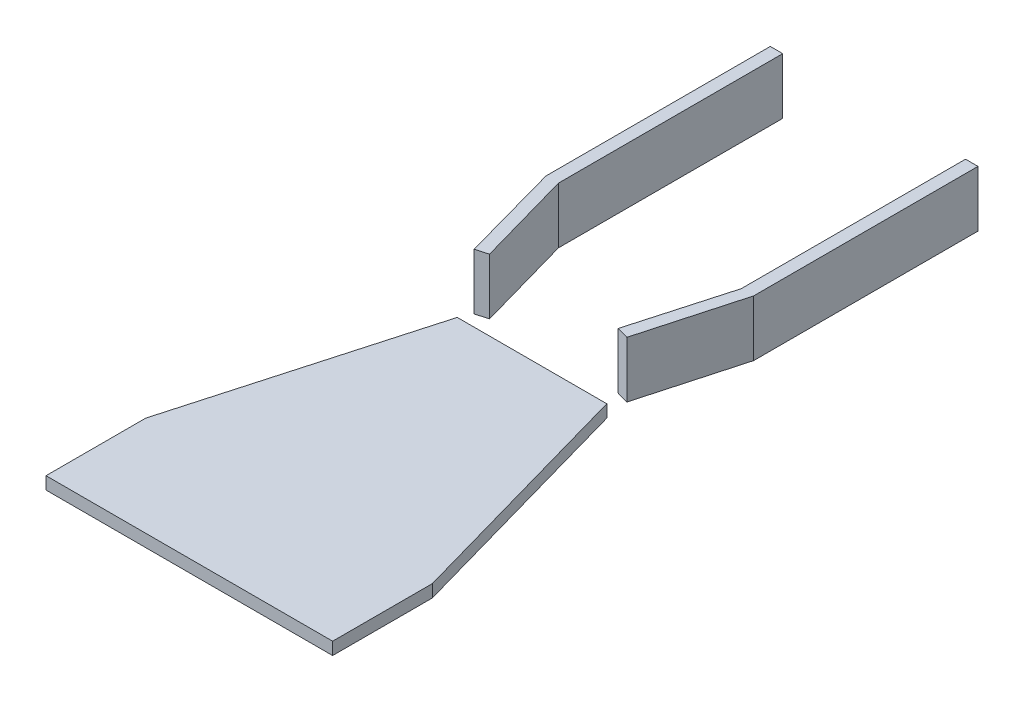
ISO-10303-21;
HEADER;
FILE_DESCRIPTION(('STEP AP214'),'2;1');
FILE_NAME('part.step','',(''),(''),'','','');
FILE_SCHEMA(('AUTOMOTIVE_DESIGN { 1 0 10303 214 1 1 1 1 }'));
ENDSEC;
DATA;
#1=APPLICATION_CONTEXT('core data for automotive mechanical design processes');
#2=APPLICATION_PROTOCOL_DEFINITION('international standard','automotive_design',2000,#1);
#3=PRODUCT_CONTEXT('',#1,'mechanical');
#4=PRODUCT('Part','Part','',(#3));
#5=PRODUCT_RELATED_PRODUCT_CATEGORY('part','',(#4));
#6=PRODUCT_DEFINITION_FORMATION('','',#4);
#7=PRODUCT_DEFINITION_CONTEXT('part definition',#1,'design');
#8=PRODUCT_DEFINITION('design','',#6,#7);
#9=PRODUCT_DEFINITION_SHAPE('','',#8);
#10=(LENGTH_UNIT() NAMED_UNIT(*) SI_UNIT(.MILLI.,.METRE.));
#11=(NAMED_UNIT(*) PLANE_ANGLE_UNIT() SI_UNIT($,.RADIAN.));
#12=(NAMED_UNIT(*) SI_UNIT($,.STERADIAN.) SOLID_ANGLE_UNIT());
#13=UNCERTAINTY_MEASURE_WITH_UNIT(LENGTH_MEASURE(1.E-05),#10,'distance_accuracy_value','');
#14=(GEOMETRIC_REPRESENTATION_CONTEXT(3) GLOBAL_UNCERTAINTY_ASSIGNED_CONTEXT((#13)) GLOBAL_UNIT_ASSIGNED_CONTEXT((#10,
#11,#12)) REPRESENTATION_CONTEXT('',''));
#15=CARTESIAN_POINT('',(0.,0.,0.));
#16=DIRECTION('',(0.,0.,1.));
#17=DIRECTION('',(1.,0.,0.));
#18=AXIS2_PLACEMENT_3D('',#15,#16,#17);
#19=CARTESIAN_POINT('',(-25.6803764915172,4.5,0.));
#20=DIRECTION('',(-1.,0.,0.));
#21=DIRECTION('',(0.,0.,-1.));
#22=AXIS2_PLACEMENT_3D('',#19,#20,#21);
#23=PLANE('',#22);
#24=DIRECTION('',(0.,0.,1.));
#25=VECTOR('',#24,1.);
#26=CARTESIAN_POINT('',(-25.6803764915172,0.,0.));
#27=LINE('',#26,#25);
#28=CARTESIAN_POINT('',(-25.6803764915172,0.,-40.5758367942845));
#29=VERTEX_POINT('',#28);
#30=CARTESIAN_POINT('',(-25.6803764915172,0.,-22.5758367942845));
#31=VERTEX_POINT('',#30);
#32=EDGE_CURVE('E141',#29,#31,#27,.T.);
#33=ORIENTED_EDGE('',*,*,#32,.T.);
#34=DIRECTION('',(0.,-1.,0.));
#35=VECTOR('',#34,1.);
#36=CARTESIAN_POINT('',(-25.6803764915172,4.5,-22.5758367942845));
#37=LINE('',#36,#35);
#38=CARTESIAN_POINT('',(-25.6803764915172,4.5,-22.5758367942845));
#39=VERTEX_POINT('',#38);
#40=EDGE_CURVE('E140',#39,#31,#37,.T.);
#41=ORIENTED_EDGE('',*,*,#40,.F.);
#42=DIRECTION('',(0.,0.,1.));
#43=VECTOR('',#42,1.);
#44=CARTESIAN_POINT('',(-25.6803764915172,4.5,0.));
#45=LINE('',#44,#43);
#46=CARTESIAN_POINT('',(-25.6803764915172,4.5,-40.5758367942845));
#47=VERTEX_POINT('',#46);
#48=EDGE_CURVE('E153',#47,#39,#45,.T.);
#49=ORIENTED_EDGE('',*,*,#48,.F.);
#50=DIRECTION('',(0.,-1.,0.));
#51=VECTOR('',#50,1.);
#52=CARTESIAN_POINT('',(-25.6803764915172,4.5,-40.5758367942845));
#53=LINE('',#52,#51);
#54=EDGE_CURVE('E12',#47,#29,#53,.T.);
#55=ORIENTED_EDGE('',*,*,#54,.T.);
#56=EDGE_LOOP('',(#33,#41,#49,#55));
#57=FACE_BOUND('',#56,.T.);
#58=ADVANCED_FACE('F58',(#57),#23,.T.);
#59=CARTESIAN_POINT('',(-66.0287413715997,4.5,-40.5758367942845));
#60=DIRECTION('',(0.,0.,-1.));
#61=DIRECTION('',(1.,0.,0.));
#62=AXIS2_PLACEMENT_3D('',#59,#60,#61);
#63=PLANE('',#62);
#64=DIRECTION('',(-1.,0.,0.));
#65=VECTOR('',#64,1.);
#66=CARTESIAN_POINT('',(-66.0287413715997,0.,-40.5758367942845));
#67=LINE('',#66,#65);
#68=CARTESIAN_POINT('',(-24.6803764915172,0.,-40.5758367942845));
#69=VERTEX_POINT('',#68);
#70=EDGE_CURVE('E144',#69,#29,#67,.T.);
#71=ORIENTED_EDGE('',*,*,#70,.T.);
#72=ORIENTED_EDGE('',*,*,#54,.F.);
#73=DIRECTION('',(-1.,0.,0.));
#74=VECTOR('',#73,1.);
#75=CARTESIAN_POINT('',(-66.0287413715997,4.5,-40.5758367942845));
#76=LINE('',#75,#74);
#77=CARTESIAN_POINT('',(-24.6803764915172,4.5,-40.5758367942845));
#78=VERTEX_POINT('',#77);
#79=EDGE_CURVE('E106',#78,#47,#76,.T.);
#80=ORIENTED_EDGE('',*,*,#79,.F.);
#81=DIRECTION('',(0.,-1.,0.));
#82=VECTOR('',#81,1.);
#83=CARTESIAN_POINT('',(-24.6803764915172,4.5,-40.5758367942845));
#84=LINE('',#83,#82);
#85=EDGE_CURVE('E66',#78,#69,#84,.T.);
#86=ORIENTED_EDGE('',*,*,#85,.T.);
#87=EDGE_LOOP('',(#71,#72,#80,#86));
#88=FACE_BOUND('',#87,.T.);
#89=ADVANCED_FACE('F160',(#88),#63,.T.);
#90=CARTESIAN_POINT('',(-24.6803764915172,4.5,0.));
#91=DIRECTION('',(-1.,0.,0.));
#92=DIRECTION('',(0.,0.,-1.));
#93=AXIS2_PLACEMENT_3D('',#90,#91,#92);
#94=PLANE('',#93);
#95=DIRECTION('',(0.,0.,1.));
#96=VECTOR('',#95,1.);
#97=CARTESIAN_POINT('',(-24.6803764915172,0.,0.));
#98=LINE('',#97,#96);
#99=CARTESIAN_POINT('',(-24.6803764915172,0.,-22.5758367942845));
#100=VERTEX_POINT('',#99);
#101=EDGE_CURVE('E146',#69,#100,#98,.T.);
#102=ORIENTED_EDGE('',*,*,#101,.F.);
#103=ORIENTED_EDGE('',*,*,#85,.F.);
#104=DIRECTION('',(0.,0.,1.));
#105=VECTOR('',#104,1.);
#106=CARTESIAN_POINT('',(-24.6803764915172,4.5,0.));
#107=LINE('',#106,#105);
#108=CARTESIAN_POINT('',(-24.6803764915172,4.5,-22.5758367942845));
#109=VERTEX_POINT('',#108);
#110=EDGE_CURVE('E134',#78,#109,#107,.T.);
#111=ORIENTED_EDGE('',*,*,#110,.T.);
#112=DIRECTION('',(0.,-1.,0.));
#113=VECTOR('',#112,1.);
#114=CARTESIAN_POINT('',(-24.6803764915172,4.5,-22.5758367942845));
#115=LINE('',#114,#113);
#116=EDGE_CURVE('E128',#109,#100,#115,.T.);
#117=ORIENTED_EDGE('',*,*,#116,.T.);
#118=EDGE_LOOP('',(#102,#103,#111,#117));
#119=FACE_BOUND('',#118,.T.);
#120=ADVANCED_FACE('F181',(#119),#94,.F.);
#121=CARTESIAN_POINT('',(-33.4406969264378,4.5,9.03199335039239));
#122=DIRECTION('',(0.963672105815585,0.,0.267088136151637));
#123=DIRECTION('',(-0.267088136151637,0.,0.963672105815585));
#124=AXIS2_PLACEMENT_3D('',#121,#122,#123);
#125=PLANE('',#124);
#126=DIRECTION('',(0.267088136151637,0.,-0.963672105815585));
#127=VECTOR('',#126,1.);
#128=CARTESIAN_POINT('',(-33.4406969264378,0.,9.03199335039239));
#129=LINE('',#128,#127);
#130=CARTESIAN_POINT('',(-26.8896081352248,0.,-14.6047792212986));
#131=VERTEX_POINT('',#130);
#132=EDGE_CURVE('E149',#131,#100,#129,.T.);
#133=ORIENTED_EDGE('',*,*,#132,.T.);
#134=ORIENTED_EDGE('',*,*,#116,.F.);
#135=DIRECTION('',(0.267088136151637,0.,-0.963672105815585));
#136=VECTOR('',#135,1.);
#137=CARTESIAN_POINT('',(-33.4406969264378,4.5,9.03199335039239));
#138=LINE('',#137,#136);
#139=CARTESIAN_POINT('',(-26.8896081352248,4.5,-14.6047792212986));
#140=VERTEX_POINT('',#139);
#141=EDGE_CURVE('E118',#140,#109,#138,.T.);
#142=ORIENTED_EDGE('',*,*,#141,.F.);
#143=DIRECTION('',(0.,-1.,0.));
#144=VECTOR('',#143,1.);
#145=CARTESIAN_POINT('',(-26.8896081352248,4.5,-14.6047792212986));
#146=LINE('',#145,#144);
#147=EDGE_CURVE('E123',#140,#131,#146,.T.);
#148=ORIENTED_EDGE('',*,*,#147,.T.);
#149=EDGE_LOOP('',(#133,#134,#142,#148));
#150=FACE_BOUND('',#149,.T.);
#151=ADVANCED_FACE('F131',(#150),#125,.T.);
#152=CARTESIAN_POINT('',(-59.3288111619271,4.5,-23.7542980215912));
#153=DIRECTION('',(-0.271460164963802,0.,0.962449676002764));
#154=DIRECTION('',(-0.962449676002764,0.,-0.271460164963802));
#155=AXIS2_PLACEMENT_3D('',#152,#153,#154);
#156=PLANE('',#155);
#157=DIRECTION('',(0.962449676002764,0.,0.271460164963802));
#158=VECTOR('',#157,1.);
#159=CARTESIAN_POINT('',(-59.3288111619271,0.,-23.7542980215912));
#160=LINE('',#159,#158);
#161=CARTESIAN_POINT('',(-27.8520578112276,0.,-14.8762393862624));
#162=VERTEX_POINT('',#161);
#163=EDGE_CURVE('E125',#162,#131,#160,.T.);
#164=ORIENTED_EDGE('',*,*,#163,.T.);
#165=ORIENTED_EDGE('',*,*,#147,.F.);
#166=DIRECTION('',(0.962449676002764,0.,0.271460164963802));
#167=VECTOR('',#166,1.);
#168=CARTESIAN_POINT('',(-59.3288111619271,4.5,-23.7542980215912));
#169=LINE('',#168,#167);
#170=CARTESIAN_POINT('',(-27.8520578112276,4.5,-14.8762393862624));
#171=VERTEX_POINT('',#170);
#172=EDGE_CURVE('E114',#171,#140,#169,.T.);
#173=ORIENTED_EDGE('',*,*,#172,.F.);
#174=DIRECTION('',(0.,-1.,0.));
#175=VECTOR('',#174,1.);
#176=CARTESIAN_POINT('',(-27.8520578112276,4.5,-14.8762393862624));
#177=LINE('',#176,#175);
#178=EDGE_CURVE('E129',#171,#162,#177,.T.);
#179=ORIENTED_EDGE('',*,*,#178,.T.);
#180=EDGE_LOOP('',(#164,#165,#173,#179));
#181=FACE_BOUND('',#180,.T.);
#182=ADVANCED_FACE('F124',(#181),#156,.T.);
#183=CARTESIAN_POINT('',(-34.5519880209002,4.5,8.87805863532892));
#184=DIRECTION('',(-0.962449676002763,0.,-0.271460164963804));
#185=DIRECTION('',(0.271460164963804,0.,-0.962449676002764));
#186=AXIS2_PLACEMENT_3D('',#183,#184,#185);
#187=PLANE('',#186);
#188=DIRECTION('',(-0.271460164963804,0.,0.962449676002763));
#189=VECTOR('',#188,1.);
#190=CARTESIAN_POINT('',(-34.5519880209002,0.,8.87805863532892));
#191=LINE('',#190,#189);
#192=EDGE_CURVE('E94',#31,#162,#191,.T.);
#193=ORIENTED_EDGE('',*,*,#192,.T.);
#194=ORIENTED_EDGE('',*,*,#178,.F.);
#195=DIRECTION('',(-0.271460164963804,0.,0.962449676002763));
#196=VECTOR('',#195,1.);
#197=CARTESIAN_POINT('',(-34.5519880209002,4.5,8.87805863532892));
#198=LINE('',#197,#196);
#199=EDGE_CURVE('E74',#39,#171,#198,.T.);
#200=ORIENTED_EDGE('',*,*,#199,.F.);
#201=ORIENTED_EDGE('',*,*,#40,.T.);
#202=EDGE_LOOP('',(#193,#194,#200,#201));
#203=FACE_BOUND('',#202,.T.);
#204=ADVANCED_FACE('F167',(#203),#187,.T.);
#205=CARTESIAN_POINT('',(-66.0287413715997,4.5,0.));
#206=DIRECTION('',(0.,1.,0.));
#207=DIRECTION('',(0.,0.,1.));
#208=AXIS2_PLACEMENT_3D('',#205,#206,#207);
#209=PLANE('',#208);
#210=ORIENTED_EDGE('',*,*,#48,.T.);
#211=ORIENTED_EDGE('',*,*,#199,.T.);
#212=ORIENTED_EDGE('',*,*,#172,.T.);
#213=ORIENTED_EDGE('',*,*,#141,.T.);
#214=ORIENTED_EDGE('',*,*,#110,.F.);
#215=ORIENTED_EDGE('',*,*,#79,.T.);
#216=EDGE_LOOP('',(#210,#211,#212,#213,#214,#215));
#217=FACE_BOUND('',#216,.T.);
#218=ADVANCED_FACE('F116',(#217),#209,.T.);
#219=CARTESIAN_POINT('',(-66.0287413715997,0.,0.));
#220=DIRECTION('',(0.,1.,0.));
#221=DIRECTION('',(0.,0.,1.));
#222=AXIS2_PLACEMENT_3D('',#219,#220,#221);
#223=PLANE('',#222);
#224=ORIENTED_EDGE('',*,*,#32,.F.);
#225=ORIENTED_EDGE('',*,*,#70,.F.);
#226=ORIENTED_EDGE('',*,*,#101,.T.);
#227=ORIENTED_EDGE('',*,*,#132,.F.);
#228=ORIENTED_EDGE('',*,*,#163,.F.);
#229=ORIENTED_EDGE('',*,*,#192,.F.);
#230=EDGE_LOOP('',(#224,#225,#226,#227,#228,#229));
#231=FACE_BOUND('',#230,.T.);
#232=ADVANCED_FACE('F162',(#231),#223,.F.);
#233=CLOSED_SHELL('',(#58,#89,#120,#151,#182,#204,#218,#232));
#234=MANIFOLD_SOLID_BREP('B2',#233);
#235=CARTESIAN_POINT('',(-40.3483648800825,4.5,0.));
#236=DIRECTION('',(1.,0.,0.));
#237=DIRECTION('',(0.,0.,-1.));
#238=AXIS2_PLACEMENT_3D('',#235,#236,#237);
#239=PLANE('',#238);
#240=DIRECTION('',(0.,0.,1.));
#241=VECTOR('',#240,1.);
#242=CARTESIAN_POINT('',(-40.3483648800825,0.,0.));
#243=LINE('',#242,#241);
#244=CARTESIAN_POINT('',(-40.3483648800825,0.,-40.5758367942845));
#245=VERTEX_POINT('',#244);
#246=CARTESIAN_POINT('',(-40.3483648800825,0.,-22.5758367942845));
#247=VERTEX_POINT('',#246);
#248=EDGE_CURVE('E330',#245,#247,#243,.T.);
#249=ORIENTED_EDGE('',*,*,#248,.F.);
#250=DIRECTION('',(0.,-1.,0.));
#251=VECTOR('',#250,1.);
#252=CARTESIAN_POINT('',(-40.3483648800825,4.5,-40.5758367942845));
#253=LINE('',#252,#251);
#254=CARTESIAN_POINT('',(-40.3483648800825,4.5,-40.5758367942845));
#255=VERTEX_POINT('',#254);
#256=EDGE_CURVE('E56',#255,#245,#253,.T.);
#257=ORIENTED_EDGE('',*,*,#256,.F.);
#258=DIRECTION('',(0.,0.,1.));
#259=VECTOR('',#258,1.);
#260=CARTESIAN_POINT('',(-40.3483648800825,4.5,0.));
#261=LINE('',#260,#259);
#262=CARTESIAN_POINT('',(-40.3483648800825,4.5,-22.5758367942845));
#263=VERTEX_POINT('',#262);
#264=EDGE_CURVE('E344',#255,#263,#261,.T.);
#265=ORIENTED_EDGE('',*,*,#264,.T.);
#266=DIRECTION('',(0.,-1.,0.));
#267=VECTOR('',#266,1.);
#268=CARTESIAN_POINT('',(-40.3483648800825,4.5,-22.5758367942845));
#269=LINE('',#268,#267);
#270=EDGE_CURVE('E265',#263,#247,#269,.T.);
#271=ORIENTED_EDGE('',*,*,#270,.T.);
#272=EDGE_LOOP('',(#249,#257,#265,#271));
#273=FACE_BOUND('',#272,.T.);
#274=ADVANCED_FACE('F249',(#273),#239,.T.);
#275=CARTESIAN_POINT('',(0.,4.5,-40.5758367942845));
#276=DIRECTION('',(0.,0.,-1.));
#277=DIRECTION('',(-1.,0.,0.));
#278=AXIS2_PLACEMENT_3D('',#275,#276,#277);
#279=PLANE('',#278);
#280=DIRECTION('',(1.,0.,0.));
#281=VECTOR('',#280,1.);
#282=CARTESIAN_POINT('',(0.,0.,-40.5758367942845));
#283=LINE('',#282,#281);
#284=CARTESIAN_POINT('',(-41.3483648800825,0.,-40.5758367942845));
#285=VERTEX_POINT('',#284);
#286=EDGE_CURVE('E332',#285,#245,#283,.T.);
#287=ORIENTED_EDGE('',*,*,#286,.F.);
#288=DIRECTION('',(0.,-1.,0.));
#289=VECTOR('',#288,1.);
#290=CARTESIAN_POINT('',(-41.3483648800825,4.5,-40.5758367942845));
#291=LINE('',#290,#289);
#292=CARTESIAN_POINT('',(-41.3483648800825,4.5,-40.5758367942845));
#293=VERTEX_POINT('',#292);
#294=EDGE_CURVE('E257',#293,#285,#291,.T.);
#295=ORIENTED_EDGE('',*,*,#294,.F.);
#296=DIRECTION('',(1.,0.,0.));
#297=VECTOR('',#296,1.);
#298=CARTESIAN_POINT('',(0.,4.5,-40.5758367942845));
#299=LINE('',#298,#297);
#300=EDGE_CURVE('E356',#293,#255,#299,.T.);
#301=ORIENTED_EDGE('',*,*,#300,.T.);
#302=ORIENTED_EDGE('',*,*,#256,.T.);
#303=EDGE_LOOP('',(#287,#295,#301,#302));
#304=FACE_BOUND('',#303,.T.);
#305=ADVANCED_FACE('F355',(#304),#279,.T.);
#306=CARTESIAN_POINT('',(-41.3483648800825,4.5,0.));
#307=DIRECTION('',(1.,0.,0.));
#308=DIRECTION('',(0.,0.,-1.));
#309=AXIS2_PLACEMENT_3D('',#306,#307,#308);
#310=PLANE('',#309);
#311=DIRECTION('',(0.,0.,1.));
#312=VECTOR('',#311,1.);
#313=CARTESIAN_POINT('',(-41.3483648800825,0.,0.));
#314=LINE('',#313,#312);
#315=CARTESIAN_POINT('',(-41.3483648800825,0.,-22.5758367942845));
#316=VERTEX_POINT('',#315);
#317=EDGE_CURVE('E335',#285,#316,#314,.T.);
#318=ORIENTED_EDGE('',*,*,#317,.T.);
#319=DIRECTION('',(0.,-1.,0.));
#320=VECTOR('',#319,1.);
#321=CARTESIAN_POINT('',(-41.3483648800825,4.5,-22.5758367942845));
#322=LINE('',#321,#320);
#323=CARTESIAN_POINT('',(-41.3483648800825,4.5,-22.5758367942845));
#324=VERTEX_POINT('',#323);
#325=EDGE_CURVE('E312',#324,#316,#322,.T.);
#326=ORIENTED_EDGE('',*,*,#325,.F.);
#327=DIRECTION('',(0.,0.,1.));
#328=VECTOR('',#327,1.);
#329=CARTESIAN_POINT('',(-41.3483648800825,4.5,0.));
#330=LINE('',#329,#328);
#331=EDGE_CURVE('E321',#293,#324,#330,.T.);
#332=ORIENTED_EDGE('',*,*,#331,.F.);
#333=ORIENTED_EDGE('',*,*,#294,.T.);
#334=EDGE_LOOP('',(#318,#326,#332,#333));
#335=FACE_BOUND('',#334,.T.);
#336=ADVANCED_FACE('F349',(#335),#310,.F.);
#337=CARTESIAN_POINT('',(-32.5880444451619,4.5,9.03199335039239));
#338=DIRECTION('',(-0.963672105815585,0.,0.267088136151637));
#339=DIRECTION('',(0.267088136151637,0.,0.963672105815585));
#340=AXIS2_PLACEMENT_3D('',#337,#338,#339);
#341=PLANE('',#340);
#342=DIRECTION('',(-0.267088136151637,0.,-0.963672105815585));
#343=VECTOR('',#342,1.);
#344=CARTESIAN_POINT('',(-32.5880444451619,0.,9.03199335039239));
#345=LINE('',#344,#343);
#346=CARTESIAN_POINT('',(-39.1391332363749,0.,-14.6047792212986));
#347=VERTEX_POINT('',#346);
#348=EDGE_CURVE('E308',#347,#316,#345,.T.);
#349=ORIENTED_EDGE('',*,*,#348,.F.);
#350=DIRECTION('',(0.,-1.,0.));
#351=VECTOR('',#350,1.);
#352=CARTESIAN_POINT('',(-39.1391332363749,4.5,-14.6047792212986));
#353=LINE('',#352,#351);
#354=CARTESIAN_POINT('',(-39.1391332363749,4.5,-14.6047792212986));
#355=VERTEX_POINT('',#354);
#356=EDGE_CURVE('E303',#355,#347,#353,.T.);
#357=ORIENTED_EDGE('',*,*,#356,.F.);
#358=DIRECTION('',(-0.267088136151637,0.,-0.963672105815585));
#359=VECTOR('',#358,1.);
#360=CARTESIAN_POINT('',(-32.5880444451619,4.5,9.03199335039239));
#361=LINE('',#360,#359);
#362=EDGE_CURVE('E306',#355,#324,#361,.T.);
#363=ORIENTED_EDGE('',*,*,#362,.T.);
#364=ORIENTED_EDGE('',*,*,#325,.T.);
#365=EDGE_LOOP('',(#349,#357,#363,#364));
#366=FACE_BOUND('',#365,.T.);
#367=ADVANCED_FACE('F305',(#366),#341,.T.);
#368=CARTESIAN_POINT('',(-6.69993020967255,4.5,-23.7542980215912));
#369=DIRECTION('',(0.271460164963802,0.,0.962449676002764));
#370=DIRECTION('',(0.962449676002764,0.,-0.271460164963802));
#371=AXIS2_PLACEMENT_3D('',#368,#369,#370);
#372=PLANE('',#371);
#373=DIRECTION('',(-0.962449676002764,0.,0.271460164963802));
#374=VECTOR('',#373,1.);
#375=CARTESIAN_POINT('',(-6.69993020967255,0.,-23.7542980215912));
#376=LINE('',#375,#374);
#377=CARTESIAN_POINT('',(-38.1766835603721,0.,-14.8762393862624));
#378=VERTEX_POINT('',#377);
#379=EDGE_CURVE('E339',#378,#347,#376,.T.);
#380=ORIENTED_EDGE('',*,*,#379,.F.);
#381=DIRECTION('',(0.,-1.,0.));
#382=VECTOR('',#381,1.);
#383=CARTESIAN_POINT('',(-38.1766835603721,4.5,-14.8762393862624));
#384=LINE('',#383,#382);
#385=CARTESIAN_POINT('',(-38.1766835603721,4.5,-14.8762393862624));
#386=VERTEX_POINT('',#385);
#387=EDGE_CURVE('E284',#386,#378,#384,.T.);
#388=ORIENTED_EDGE('',*,*,#387,.F.);
#389=DIRECTION('',(-0.962449676002764,0.,0.271460164963802));
#390=VECTOR('',#389,1.);
#391=CARTESIAN_POINT('',(-6.69993020967255,4.5,-23.7542980215912));
#392=LINE('',#391,#390);
#393=EDGE_CURVE('E318',#386,#355,#392,.T.);
#394=ORIENTED_EDGE('',*,*,#393,.T.);
#395=ORIENTED_EDGE('',*,*,#356,.T.);
#396=EDGE_LOOP('',(#380,#388,#394,#395));
#397=FACE_BOUND('',#396,.T.);
#398=ADVANCED_FACE('F324',(#397),#372,.T.);
#399=CARTESIAN_POINT('',(-31.4767533506995,4.5,8.87805863532892));
#400=DIRECTION('',(0.962449676002763,0.,-0.271460164963804));
#401=DIRECTION('',(-0.271460164963804,0.,-0.962449676002764));
#402=AXIS2_PLACEMENT_3D('',#399,#400,#401);
#403=PLANE('',#402);
#404=DIRECTION('',(0.271460164963804,0.,0.962449676002763));
#405=VECTOR('',#404,1.);
#406=CARTESIAN_POINT('',(-31.4767533506995,0.,8.87805863532892));
#407=LINE('',#406,#405);
#408=EDGE_CURVE('E341',#247,#378,#407,.T.);
#409=ORIENTED_EDGE('',*,*,#408,.F.);
#410=ORIENTED_EDGE('',*,*,#270,.F.);
#411=DIRECTION('',(0.271460164963804,0.,0.962449676002763));
#412=VECTOR('',#411,1.);
#413=CARTESIAN_POINT('',(-31.4767533506995,4.5,8.87805863532892));
#414=LINE('',#413,#412);
#415=EDGE_CURVE('E325',#263,#386,#414,.T.);
#416=ORIENTED_EDGE('',*,*,#415,.T.);
#417=ORIENTED_EDGE('',*,*,#387,.T.);
#418=EDGE_LOOP('',(#409,#410,#416,#417));
#419=FACE_BOUND('',#418,.T.);
#420=ADVANCED_FACE('F357',(#419),#403,.T.);
#421=CARTESIAN_POINT('',(0.,4.5,0.));
#422=DIRECTION('',(0.,1.,0.));
#423=DIRECTION('',(0.,0.,1.));
#424=AXIS2_PLACEMENT_3D('',#421,#422,#423);
#425=PLANE('',#424);
#426=ORIENTED_EDGE('',*,*,#264,.F.);
#427=ORIENTED_EDGE('',*,*,#300,.F.);
#428=ORIENTED_EDGE('',*,*,#331,.T.);
#429=ORIENTED_EDGE('',*,*,#362,.F.);
#430=ORIENTED_EDGE('',*,*,#393,.F.);
#431=ORIENTED_EDGE('',*,*,#415,.F.);
#432=EDGE_LOOP('',(#426,#427,#428,#429,#430,#431));
#433=FACE_BOUND('',#432,.T.);
#434=ADVANCED_FACE('F316',(#433),#425,.T.);
#435=CARTESIAN_POINT('',(0.,0.,0.));
#436=DIRECTION('',(0.,1.,0.));
#437=DIRECTION('',(0.,0.,1.));
#438=AXIS2_PLACEMENT_3D('',#435,#436,#437);
#439=PLANE('',#438);
#440=ORIENTED_EDGE('',*,*,#248,.T.);
#441=ORIENTED_EDGE('',*,*,#408,.T.);
#442=ORIENTED_EDGE('',*,*,#379,.T.);
#443=ORIENTED_EDGE('',*,*,#348,.T.);
#444=ORIENTED_EDGE('',*,*,#317,.F.);
#445=ORIENTED_EDGE('',*,*,#286,.T.);
#446=EDGE_LOOP('',(#440,#441,#442,#443,#444,#445));
#447=FACE_BOUND('',#446,.T.);
#448=ADVANCED_FACE('F354',(#447),#439,.F.);
#449=CLOSED_SHELL('',(#274,#305,#336,#367,#398,#420,#434,#448));
#450=MANIFOLD_SOLID_BREP('B6',#449);
#451=CARTESIAN_POINT('',(-39.048974320646,1.,-11.0138132699258));
#452=DIRECTION('',(-0.962449675986404,0.,-0.271460165021806));
#453=DIRECTION('',(-0.271460165021806,0.,0.962449675986404));
#454=AXIS2_PLACEMENT_3D('',#451,#452,#453);
#455=PLANE('',#454);
#456=DIRECTION('',(0.271460165021806,0.,-0.962449675986404));
#457=VECTOR('',#456,1.);
#458=CARTESIAN_POINT('',(-39.048974320646,0.,-11.0138132699258));
#459=LINE('',#458,#457);
#460=CARTESIAN_POINT('',(-44.0773532543602,0.,6.81407567687912));
#461=VERTEX_POINT('',#460);
#462=CARTESIAN_POINT('',(-38.5773532543602,0.,-12.6859243231209));
#463=VERTEX_POINT('',#462);
#464=EDGE_CURVE('E518',#461,#463,#459,.T.);
#465=ORIENTED_EDGE('',*,*,#464,.F.);
#466=DIRECTION('',(0.,-1.,0.));
#467=VECTOR('',#466,1.);
#468=CARTESIAN_POINT('',(-44.0773532543602,1.,6.81407567687912));
#469=LINE('',#468,#467);
#470=CARTESIAN_POINT('',(-44.0773532543602,1.,6.81407567687912));
#471=VERTEX_POINT('',#470);
#472=EDGE_CURVE('E247',#471,#461,#469,.T.);
#473=ORIENTED_EDGE('',*,*,#472,.F.);
#474=DIRECTION('',(0.271460165021806,0.,-0.962449675986404));
#475=VECTOR('',#474,1.);
#476=CARTESIAN_POINT('',(-39.048974320646,1.,-11.0138132699258));
#477=LINE('',#476,#475);
#478=CARTESIAN_POINT('',(-38.5773532543602,1.,-12.6859243231209));
#479=VERTEX_POINT('',#478);
#480=EDGE_CURVE('E537',#471,#479,#477,.T.);
#481=ORIENTED_EDGE('',*,*,#480,.T.);
#482=DIRECTION('',(0.,-1.,0.));
#483=VECTOR('',#482,1.);
#484=CARTESIAN_POINT('',(-38.5773532543602,1.,-12.6859243231209));
#485=LINE('',#484,#483);
#486=EDGE_CURVE('E448',#479,#463,#485,.T.);
#487=ORIENTED_EDGE('',*,*,#486,.T.);
#488=EDGE_LOOP('',(#465,#473,#481,#487));
#489=FACE_BOUND('',#488,.T.);
#490=ADVANCED_FACE('F431',(#489),#455,.T.);
#491=CARTESIAN_POINT('',(-44.0773532543602,1.,0.));
#492=DIRECTION('',(-1.,0.,0.));
#493=DIRECTION('',(0.,0.,1.));
#494=AXIS2_PLACEMENT_3D('',#491,#492,#493);
#495=PLANE('',#494);
#496=DIRECTION('',(0.,0.,-1.));
#497=VECTOR('',#496,1.);
#498=CARTESIAN_POINT('',(-44.0773532543602,0.,0.));
#499=LINE('',#498,#497);
#500=CARTESIAN_POINT('',(-44.0773532543602,0.,14.8140756768791));
#501=VERTEX_POINT('',#500);
#502=EDGE_CURVE('E521',#501,#461,#499,.T.);
#503=ORIENTED_EDGE('',*,*,#502,.F.);
#504=DIRECTION('',(0.,-1.,0.));
#505=VECTOR('',#504,1.);
#506=CARTESIAN_POINT('',(-44.0773532543602,1.,14.8140756768791));
#507=LINE('',#506,#505);
#508=CARTESIAN_POINT('',(-44.0773532543602,1.,14.8140756768791));
#509=VERTEX_POINT('',#508);
#510=EDGE_CURVE('E440',#509,#501,#507,.T.);
#511=ORIENTED_EDGE('',*,*,#510,.F.);
#512=DIRECTION('',(0.,0.,-1.));
#513=VECTOR('',#512,1.);
#514=CARTESIAN_POINT('',(-44.0773532543602,1.,0.));
#515=LINE('',#514,#513);
#516=EDGE_CURVE('E553',#509,#471,#515,.T.);
#517=ORIENTED_EDGE('',*,*,#516,.T.);
#518=ORIENTED_EDGE('',*,*,#472,.T.);
#519=EDGE_LOOP('',(#503,#511,#517,#518));
#520=FACE_BOUND('',#519,.T.);
#521=ADVANCED_FACE('F552',(#520),#495,.T.);
#522=CARTESIAN_POINT('',(0.,1.,14.8140756768791));
#523=DIRECTION('',(0.,0.,-1.));
#524=DIRECTION('',(-1.,0.,0.));
#525=AXIS2_PLACEMENT_3D('',#522,#523,#524);
#526=PLANE('',#525);
#527=DIRECTION('',(1.,0.,0.));
#528=VECTOR('',#527,1.);
#529=CARTESIAN_POINT('',(0.,0.,14.8140756768791));
#530=LINE('',#529,#528);
#531=CARTESIAN_POINT('',(-21.0773532543602,0.,14.8140756768791));
#532=VERTEX_POINT('',#531);
#533=EDGE_CURVE('E525',#501,#532,#530,.T.);
#534=ORIENTED_EDGE('',*,*,#533,.T.);
#535=DIRECTION('',(0.,-1.,0.));
#536=VECTOR('',#535,1.);
#537=CARTESIAN_POINT('',(-21.0773532543602,1.,14.8140756768791));
#538=LINE('',#537,#536);
#539=CARTESIAN_POINT('',(-21.0773532543602,1.,14.8140756768791));
#540=VERTEX_POINT('',#539);
#541=EDGE_CURVE('E508',#540,#532,#538,.T.);
#542=ORIENTED_EDGE('',*,*,#541,.F.);
#543=DIRECTION('',(1.,0.,0.));
#544=VECTOR('',#543,1.);
#545=CARTESIAN_POINT('',(0.,1.,14.8140756768791));
#546=LINE('',#545,#544);
#547=EDGE_CURVE('E494',#509,#540,#546,.T.);
#548=ORIENTED_EDGE('',*,*,#547,.F.);
#549=ORIENTED_EDGE('',*,*,#510,.T.);
#550=EDGE_LOOP('',(#534,#542,#548,#549));
#551=FACE_BOUND('',#550,.T.);
#552=ADVANCED_FACE('F546',(#551),#526,.F.);
#553=CARTESIAN_POINT('',(-21.0773532543602,1.,0.));
#554=DIRECTION('',(-1.,0.,0.));
#555=DIRECTION('',(0.,0.,1.));
#556=AXIS2_PLACEMENT_3D('',#553,#554,#555);
#557=PLANE('',#556);
#558=DIRECTION('',(0.,0.,-1.));
#559=VECTOR('',#558,1.);
#560=CARTESIAN_POINT('',(-21.0773532543602,0.,0.));
#561=LINE('',#560,#559);
#562=CARTESIAN_POINT('',(-21.0773532543602,0.,6.81407567687912));
#563=VERTEX_POINT('',#562);
#564=EDGE_CURVE('E504',#532,#563,#561,.T.);
#565=ORIENTED_EDGE('',*,*,#564,.T.);
#566=DIRECTION('',(0.,-1.,0.));
#567=VECTOR('',#566,1.);
#568=CARTESIAN_POINT('',(-21.0773532543602,1.,6.81407567687912));
#569=LINE('',#568,#567);
#570=CARTESIAN_POINT('',(-21.0773532543602,1.,6.81407567687912));
#571=VERTEX_POINT('',#570);
#572=EDGE_CURVE('E501',#571,#563,#569,.T.);
#573=ORIENTED_EDGE('',*,*,#572,.F.);
#574=DIRECTION('',(0.,0.,-1.));
#575=VECTOR('',#574,1.);
#576=CARTESIAN_POINT('',(-21.0773532543602,1.,0.));
#577=LINE('',#576,#575);
#578=EDGE_CURVE('E486',#540,#571,#577,.T.);
#579=ORIENTED_EDGE('',*,*,#578,.F.);
#580=ORIENTED_EDGE('',*,*,#541,.T.);
#581=EDGE_LOOP('',(#565,#573,#579,#580));
#582=FACE_BOUND('',#581,.T.);
#583=ADVANCED_FACE('F502',(#582),#557,.F.);
#584=CARTESIAN_POINT('',(-21.3044413917558,1.,6.00894500793113));
#585=DIRECTION('',(0.962449675986404,0.,-0.271460165021806));
#586=DIRECTION('',(-0.271460165021806,0.,-0.962449675986404));
#587=AXIS2_PLACEMENT_3D('',#584,#585,#586);
#588=PLANE('',#587);
#589=DIRECTION('',(0.271460165021806,0.,0.962449675986404));
#590=VECTOR('',#589,1.);
#591=CARTESIAN_POINT('',(-21.3044413917558,0.,6.00894500793113));
#592=LINE('',#591,#590);
#593=CARTESIAN_POINT('',(-26.5773532543602,0.,-12.6859243231209));
#594=VERTEX_POINT('',#593);
#595=EDGE_CURVE('E530',#594,#563,#592,.T.);
#596=ORIENTED_EDGE('',*,*,#595,.F.);
#597=DIRECTION('',(0.,-1.,0.));
#598=VECTOR('',#597,1.);
#599=CARTESIAN_POINT('',(-26.5773532543602,1.,-12.6859243231209));
#600=LINE('',#599,#598);
#601=CARTESIAN_POINT('',(-26.5773532543602,1.,-12.6859243231209));
#602=VERTEX_POINT('',#601);
#603=EDGE_CURVE('E467',#602,#594,#600,.T.);
#604=ORIENTED_EDGE('',*,*,#603,.F.);
#605=DIRECTION('',(0.271460165021806,0.,0.962449675986404));
#606=VECTOR('',#605,1.);
#607=CARTESIAN_POINT('',(-21.3044413917558,1.,6.00894500793113));
#608=LINE('',#607,#606);
#609=EDGE_CURVE('E491',#602,#571,#608,.T.);
#610=ORIENTED_EDGE('',*,*,#609,.T.);
#611=ORIENTED_EDGE('',*,*,#572,.T.);
#612=EDGE_LOOP('',(#596,#604,#610,#611));
#613=FACE_BOUND('',#612,.T.);
#614=ADVANCED_FACE('F510',(#613),#588,.T.);
#615=CARTESIAN_POINT('',(0.,1.,-12.6859243231209));
#616=DIRECTION('',(0.,0.,-1.));
#617=DIRECTION('',(-1.,0.,0.));
#618=AXIS2_PLACEMENT_3D('',#615,#616,#617);
#619=PLANE('',#618);
#620=DIRECTION('',(1.,0.,0.));
#621=VECTOR('',#620,1.);
#622=CARTESIAN_POINT('',(0.,0.,-12.6859243231209));
#623=LINE('',#622,#621);
#624=EDGE_CURVE('E533',#463,#594,#623,.T.);
#625=ORIENTED_EDGE('',*,*,#624,.F.);
#626=ORIENTED_EDGE('',*,*,#486,.F.);
#627=DIRECTION('',(1.,0.,0.));
#628=VECTOR('',#627,1.);
#629=CARTESIAN_POINT('',(0.,1.,-12.6859243231209));
#630=LINE('',#629,#628);
#631=EDGE_CURVE('E512',#479,#602,#630,.T.);
#632=ORIENTED_EDGE('',*,*,#631,.T.);
#633=ORIENTED_EDGE('',*,*,#603,.T.);
#634=EDGE_LOOP('',(#625,#626,#632,#633));
#635=FACE_BOUND('',#634,.T.);
#636=ADVANCED_FACE('F554',(#635),#619,.T.);
#637=CARTESIAN_POINT('',(0.,1.,0.));
#638=DIRECTION('',(0.,1.,0.));
#639=DIRECTION('',(0.,0.,1.));
#640=AXIS2_PLACEMENT_3D('',#637,#638,#639);
#641=PLANE('',#640);
#642=ORIENTED_EDGE('',*,*,#480,.F.);
#643=ORIENTED_EDGE('',*,*,#516,.F.);
#644=ORIENTED_EDGE('',*,*,#547,.T.);
#645=ORIENTED_EDGE('',*,*,#578,.T.);
#646=ORIENTED_EDGE('',*,*,#609,.F.);
#647=ORIENTED_EDGE('',*,*,#631,.F.);
#648=EDGE_LOOP('',(#642,#643,#644,#645,#646,#647));
#649=FACE_BOUND('',#648,.T.);
#650=ADVANCED_FACE('F488',(#649),#641,.T.);
#651=CARTESIAN_POINT('',(0.,0.,0.));
#652=DIRECTION('',(0.,1.,0.));
#653=DIRECTION('',(0.,0.,1.));
#654=AXIS2_PLACEMENT_3D('',#651,#652,#653);
#655=PLANE('',#654);
#656=ORIENTED_EDGE('',*,*,#464,.T.);
#657=ORIENTED_EDGE('',*,*,#624,.T.);
#658=ORIENTED_EDGE('',*,*,#595,.T.);
#659=ORIENTED_EDGE('',*,*,#564,.F.);
#660=ORIENTED_EDGE('',*,*,#533,.F.);
#661=ORIENTED_EDGE('',*,*,#502,.T.);
#662=EDGE_LOOP('',(#656,#657,#658,#659,#660,#661));
#663=FACE_BOUND('',#662,.T.);
#664=ADVANCED_FACE('F551',(#663),#655,.F.);
#665=CLOSED_SHELL('',(#490,#521,#552,#583,#614,#636,#650,#664));
#666=MANIFOLD_SOLID_BREP('B50',#665);
#667=ADVANCED_BREP_SHAPE_REPRESENTATION('',(#18,#234,#450,#666),#14);
#668=SHAPE_DEFINITION_REPRESENTATION(#9,#667);
ENDSEC;
END-ISO-10303-21;
